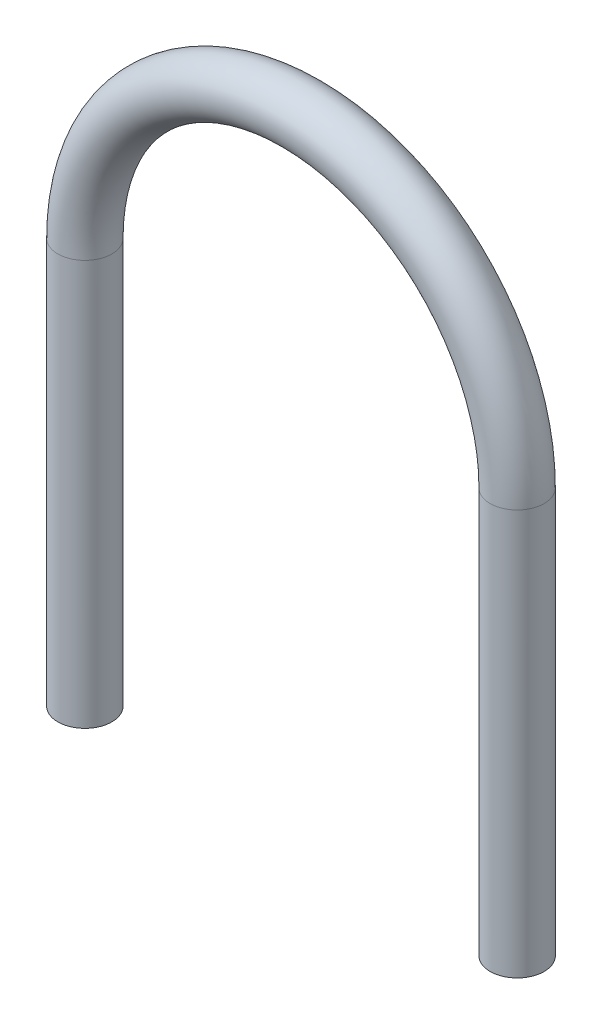
ISO-10303-21;
HEADER;
FILE_DESCRIPTION(('STEP AP214'),'2;1');
FILE_NAME('part.step','',(''),(''),'','','');
FILE_SCHEMA(('AUTOMOTIVE_DESIGN { 1 0 10303 214 1 1 1 1 }'));
ENDSEC;
DATA;
#1=APPLICATION_CONTEXT('core data for automotive mechanical design processes');
#2=APPLICATION_PROTOCOL_DEFINITION('international standard','automotive_design',2000,#1);
#3=PRODUCT_CONTEXT('',#1,'mechanical');
#4=PRODUCT('Part','Part','',(#3));
#5=PRODUCT_RELATED_PRODUCT_CATEGORY('part','',(#4));
#6=PRODUCT_DEFINITION_FORMATION('','',#4);
#7=PRODUCT_DEFINITION_CONTEXT('part definition',#1,'design');
#8=PRODUCT_DEFINITION('design','',#6,#7);
#9=PRODUCT_DEFINITION_SHAPE('','',#8);
#10=(LENGTH_UNIT() NAMED_UNIT(*) SI_UNIT(.MILLI.,.METRE.));
#11=(NAMED_UNIT(*) PLANE_ANGLE_UNIT() SI_UNIT($,.RADIAN.));
#12=(NAMED_UNIT(*) SI_UNIT($,.STERADIAN.) SOLID_ANGLE_UNIT());
#13=UNCERTAINTY_MEASURE_WITH_UNIT(LENGTH_MEASURE(1.E-05),#10,'distance_accuracy_value','');
#14=(GEOMETRIC_REPRESENTATION_CONTEXT(3) GLOBAL_UNCERTAINTY_ASSIGNED_CONTEXT((#13)) GLOBAL_UNIT_ASSIGNED_CONTEXT((#10,
#11,#12)) REPRESENTATION_CONTEXT('',''));
#15=CARTESIAN_POINT('',(0.,0.,0.));
#16=DIRECTION('',(0.,0.,1.));
#17=DIRECTION('',(1.,0.,0.));
#18=AXIS2_PLACEMENT_3D('',#15,#16,#17);
#19=CARTESIAN_POINT('',(22.225,-25.4,0.));
#20=DIRECTION('',(0.,-1.,0.));
#21=DIRECTION('',(0.,0.,-1.));
#22=AXIS2_PLACEMENT_3D('',#19,#20,#21);
#23=PLANE('',#22);
#24=CARTESIAN_POINT('',(25.4,-25.4,0.));
#25=DIRECTION('',(0.,-1.,0.));
#26=DIRECTION('',(0.,0.,-1.));
#27=AXIS2_PLACEMENT_3D('',#24,#25,#26);
#28=CIRCLE('',#27,3.175);
#29=CARTESIAN_POINT('',(25.4,-25.4,-3.175));
#30=VERTEX_POINT('',#29);
#31=EDGE_CURVE('E17',#30,#30,#28,.F.);
#32=ORIENTED_EDGE('',*,*,#31,.F.);
#33=EDGE_LOOP('',(#32));
#34=FACE_BOUND('',#33,.T.);
#35=ADVANCED_FACE('F14',(#34),#23,.T.);
#36=CARTESIAN_POINT('',(-22.225,-25.4,0.));
#37=DIRECTION('',(0.,1.,0.));
#38=DIRECTION('',(0.,0.,1.));
#39=AXIS2_PLACEMENT_3D('',#36,#37,#38);
#40=PLANE('',#39);
#41=CARTESIAN_POINT('',(-25.4,-25.4,0.));
#42=DIRECTION('',(0.,1.,0.));
#43=DIRECTION('',(0.,0.,1.));
#44=AXIS2_PLACEMENT_3D('',#41,#42,#43);
#45=CIRCLE('',#44,3.175);
#46=CARTESIAN_POINT('',(-25.4,-25.4,3.175));
#47=VERTEX_POINT('',#46);
#48=EDGE_CURVE('E26',#47,#47,#45,.T.);
#49=ORIENTED_EDGE('',*,*,#48,.F.);
#50=EDGE_LOOP('',(#49));
#51=FACE_BOUND('',#50,.T.);
#52=ADVANCED_FACE('F40',(#51),#40,.F.);
#53=CARTESIAN_POINT('',(25.4,22.225,0.));
#54=DIRECTION('',(0.,-1.,0.));
#55=DIRECTION('',(0.,0.,-1.));
#56=AXIS2_PLACEMENT_3D('',#53,#54,#55);
#57=CYLINDRICAL_SURFACE('',#56,3.175);
#58=ORIENTED_EDGE('',*,*,#31,.T.);
#59=EDGE_LOOP('',(#58));
#60=FACE_BOUND('',#59,.T.);
#61=CARTESIAN_POINT('',(25.4,22.225,0.));
#62=DIRECTION('',(0.,-1.,0.));
#63=DIRECTION('',(1.,0.,0.));
#64=AXIS2_PLACEMENT_3D('',#61,#62,#63);
#65=CIRCLE('',#64,3.175);
#66=CARTESIAN_POINT('',(28.575,22.225,0.));
#67=VERTEX_POINT('',#66);
#68=EDGE_CURVE('E21',#67,#67,#65,.F.);
#69=ORIENTED_EDGE('',*,*,#68,.F.);
#70=EDGE_LOOP('',(#69));
#71=FACE_BOUND('',#70,.T.);
#72=ADVANCED_FACE('F36',(#60,#71),#57,.T.);
#73=CARTESIAN_POINT('',(-25.4,-25.4,0.));
#74=DIRECTION('',(0.,1.,0.));
#75=DIRECTION('',(0.,0.,1.));
#76=AXIS2_PLACEMENT_3D('',#73,#74,#75);
#77=CYLINDRICAL_SURFACE('',#76,3.175);
#78=CARTESIAN_POINT('',(-25.4,22.225,0.));
#79=DIRECTION('',(0.,1.,0.));
#80=DIRECTION('',(-1.,0.,0.));
#81=AXIS2_PLACEMENT_3D('',#78,#79,#80);
#82=CIRCLE('',#81,3.175);
#83=CARTESIAN_POINT('',(-28.575,22.225,0.));
#84=VERTEX_POINT('',#83);
#85=EDGE_CURVE('E10',#84,#84,#82,.T.);
#86=ORIENTED_EDGE('',*,*,#85,.F.);
#87=EDGE_LOOP('',(#86));
#88=FACE_BOUND('',#87,.T.);
#89=ORIENTED_EDGE('',*,*,#48,.T.);
#90=EDGE_LOOP('',(#89));
#91=FACE_BOUND('',#90,.T.);
#92=ADVANCED_FACE('F48',(#88,#91),#77,.T.);
#93=CARTESIAN_POINT('',(0.,22.225,0.));
#94=DIRECTION('',(0.,0.,-1.));
#95=DIRECTION('',(1.,0.,0.));
#96=AXIS2_PLACEMENT_3D('',#93,#94,#95);
#97=TOROIDAL_SURFACE('',#96,25.4,3.175);
#98=ORIENTED_EDGE('',*,*,#68,.T.);
#99=EDGE_LOOP('',(#98));
#100=FACE_BOUND('',#99,.T.);
#101=ORIENTED_EDGE('',*,*,#85,.T.);
#102=EDGE_LOOP('',(#101));
#103=FACE_BOUND('',#102,.T.);
#104=ADVANCED_FACE('F46',(#100,#103),#97,.T.);
#105=CLOSED_SHELL('',(#35,#52,#72,#92,#104));
#106=MANIFOLD_SOLID_BREP('B1',#105);
#107=ADVANCED_BREP_SHAPE_REPRESENTATION('',(#18,#106),#14);
#108=SHAPE_DEFINITION_REPRESENTATION(#9,#107);
ENDSEC;
END-ISO-10303-21;
